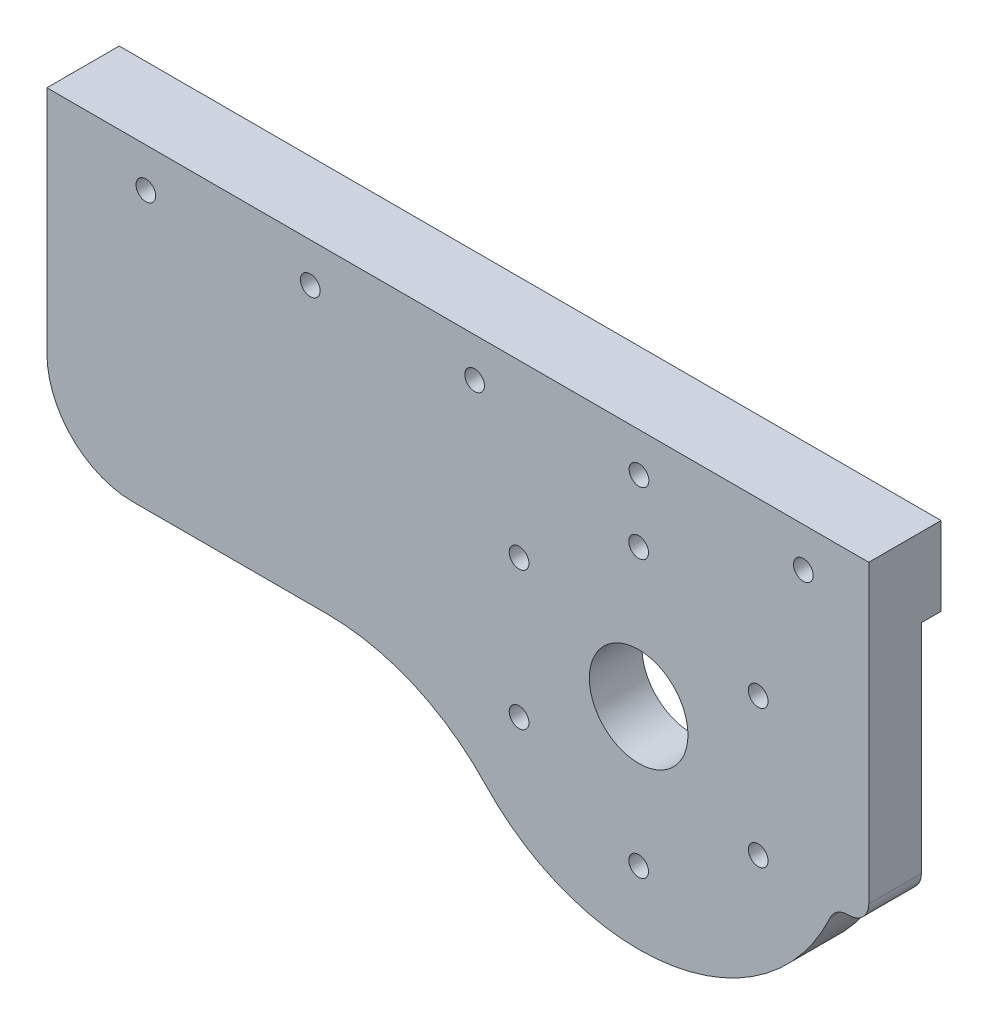
ISO-10303-21;
HEADER;
FILE_DESCRIPTION(('STEP AP214'),'2;1');
FILE_NAME('part.step','',(''),(''),'','','');
FILE_SCHEMA(('AUTOMOTIVE_DESIGN { 1 0 10303 214 1 1 1 1 }'));
ENDSEC;
DATA;
#1=APPLICATION_CONTEXT('core data for automotive mechanical design processes');
#2=APPLICATION_PROTOCOL_DEFINITION('international standard','automotive_design',2000,#1);
#3=PRODUCT_CONTEXT('',#1,'mechanical');
#4=PRODUCT('Part','Part','',(#3));
#5=PRODUCT_RELATED_PRODUCT_CATEGORY('part','',(#4));
#6=PRODUCT_DEFINITION_FORMATION('','',#4);
#7=PRODUCT_DEFINITION_CONTEXT('part definition',#1,'design');
#8=PRODUCT_DEFINITION('design','',#6,#7);
#9=PRODUCT_DEFINITION_SHAPE('','',#8);
#10=(LENGTH_UNIT() NAMED_UNIT(*) SI_UNIT(.MILLI.,.METRE.));
#11=(NAMED_UNIT(*) PLANE_ANGLE_UNIT() SI_UNIT($,.RADIAN.));
#12=(NAMED_UNIT(*) SI_UNIT($,.STERADIAN.) SOLID_ANGLE_UNIT());
#13=UNCERTAINTY_MEASURE_WITH_UNIT(LENGTH_MEASURE(1.E-05),#10,'distance_accuracy_value','');
#14=(GEOMETRIC_REPRESENTATION_CONTEXT(3) GLOBAL_UNCERTAINTY_ASSIGNED_CONTEXT((#13)) GLOBAL_UNIT_ASSIGNED_CONTEXT((#10,
#11,#12)) REPRESENTATION_CONTEXT('',''));
#15=CARTESIAN_POINT('',(0.,0.,0.));
#16=DIRECTION('',(0.,0.,1.));
#17=DIRECTION('',(1.,0.,0.));
#18=AXIS2_PLACEMENT_3D('',#15,#16,#17);
#19=CARTESIAN_POINT('',(-120.531714020429,7.0000077107353,68.1400002949939));
#20=DIRECTION('',(0.,0.,-1.));
#21=DIRECTION('',(-1.,0.,0.));
#22=AXIS2_PLACEMENT_3D('',#19,#20,#21);
#23=CYLINDRICAL_SURFACE('',#22,1.49999999999999);
#24=CARTESIAN_POINT('',(-120.531714020429,7.0000077107353,8.));
#25=DIRECTION('',(0.,0.,1.));
#26=DIRECTION('',(1.,0.,0.));
#27=AXIS2_PLACEMENT_3D('',#24,#25,#26);
#28=CIRCLE('',#27,1.49999999999999);
#29=CARTESIAN_POINT('',(-119.031714020429,7.0000077107353,8.));
#30=VERTEX_POINT('',#29);
#31=EDGE_CURVE('E193',#30,#30,#28,.F.);
#32=ORIENTED_EDGE('',*,*,#31,.F.);
#33=EDGE_LOOP('',(#32));
#34=FACE_BOUND('',#33,.T.);
#35=CARTESIAN_POINT('',(-120.531714020429,7.0000077107353,4.));
#36=DIRECTION('',(0.,0.,-1.));
#37=DIRECTION('',(-1.,0.,0.));
#38=AXIS2_PLACEMENT_3D('',#35,#36,#37);
#39=CIRCLE('',#38,1.49999999999999);
#40=CARTESIAN_POINT('',(-122.031714020429,7.0000077107353,4.));
#41=VERTEX_POINT('',#40);
#42=EDGE_CURVE('E47',#41,#41,#39,.F.);
#43=ORIENTED_EDGE('',*,*,#42,.F.);
#44=EDGE_LOOP('',(#43));
#45=FACE_BOUND('',#44,.T.);
#46=ADVANCED_FACE('F43',(#34,#45),#23,.F.);
#47=CARTESIAN_POINT('',(-138.718247499902,17.5000077107355,68.1400002949939));
#48=DIRECTION('',(0.,0.,-1.));
#49=DIRECTION('',(-1.,0.,0.));
#50=AXIS2_PLACEMENT_3D('',#47,#48,#49);
#51=CYLINDRICAL_SURFACE('',#50,1.5);
#52=CARTESIAN_POINT('',(-138.718247499902,17.5000077107355,8.));
#53=DIRECTION('',(0.,0.,1.));
#54=DIRECTION('',(1.,0.,0.));
#55=AXIS2_PLACEMENT_3D('',#52,#53,#54);
#56=CIRCLE('',#55,1.5);
#57=CARTESIAN_POINT('',(-137.218247499902,17.5000077107355,8.));
#58=VERTEX_POINT('',#57);
#59=EDGE_CURVE('E161',#58,#58,#56,.F.);
#60=ORIENTED_EDGE('',*,*,#59,.F.);
#61=EDGE_LOOP('',(#60));
#62=FACE_BOUND('',#61,.T.);
#63=CARTESIAN_POINT('',(-138.718247499902,17.5000077107355,4.));
#64=DIRECTION('',(0.,0.,-1.));
#65=DIRECTION('',(-1.,0.,0.));
#66=AXIS2_PLACEMENT_3D('',#63,#64,#65);
#67=CIRCLE('',#66,1.5);
#68=CARTESIAN_POINT('',(-140.218247499902,17.5000077107355,4.));
#69=VERTEX_POINT('',#68);
#70=EDGE_CURVE('E296',#69,#69,#67,.F.);
#71=ORIENTED_EDGE('',*,*,#70,.F.);
#72=EDGE_LOOP('',(#71));
#73=FACE_BOUND('',#72,.T.);
#74=ADVANCED_FACE('F408',(#62,#73),#51,.F.);
#75=CARTESIAN_POINT('',(-102.345180540956,17.5000077107352,68.1400002949939));
#76=DIRECTION('',(0.,0.,-1.));
#77=DIRECTION('',(-1.,0.,0.));
#78=AXIS2_PLACEMENT_3D('',#75,#76,#77);
#79=CYLINDRICAL_SURFACE('',#78,1.50000000000001);
#80=CARTESIAN_POINT('',(-102.345180540956,17.5000077107352,8.));
#81=DIRECTION('',(0.,0.,1.));
#82=DIRECTION('',(1.,0.,0.));
#83=AXIS2_PLACEMENT_3D('',#80,#81,#82);
#84=CIRCLE('',#83,1.50000000000001);
#85=CARTESIAN_POINT('',(-100.845180540956,17.5000077107352,8.));
#86=VERTEX_POINT('',#85);
#87=EDGE_CURVE('E205',#86,#86,#84,.F.);
#88=ORIENTED_EDGE('',*,*,#87,.F.);
#89=EDGE_LOOP('',(#88));
#90=FACE_BOUND('',#89,.T.);
#91=CARTESIAN_POINT('',(-102.345180540956,17.5000077107352,4.));
#92=DIRECTION('',(0.,0.,-1.));
#93=DIRECTION('',(-1.,0.,0.));
#94=AXIS2_PLACEMENT_3D('',#91,#92,#93);
#95=CIRCLE('',#94,1.50000000000001);
#96=CARTESIAN_POINT('',(-103.845180540956,17.5000077107352,4.));
#97=VERTEX_POINT('',#96);
#98=EDGE_CURVE('E294',#97,#97,#95,.F.);
#99=ORIENTED_EDGE('',*,*,#98,.F.);
#100=EDGE_LOOP('',(#99));
#101=FACE_BOUND('',#100,.T.);
#102=ADVANCED_FACE('F414',(#90,#101),#79,.F.);
#103=CARTESIAN_POINT('',(-138.718247499902,38.5000077107355,10.));
#104=DIRECTION('',(0.,0.,-1.));
#105=DIRECTION('',(-1.,0.,0.));
#106=AXIS2_PLACEMENT_3D('',#103,#104,#105);
#107=CYLINDRICAL_SURFACE('',#106,1.50000000000001);
#108=CARTESIAN_POINT('',(-138.718247499902,38.5000077107355,8.));
#109=DIRECTION('',(0.,0.,1.));
#110=DIRECTION('',(1.,0.,0.));
#111=AXIS2_PLACEMENT_3D('',#108,#109,#110);
#112=CIRCLE('',#111,1.50000000000001);
#113=CARTESIAN_POINT('',(-137.218247499902,38.5000077107355,8.));
#114=VERTEX_POINT('',#113);
#115=EDGE_CURVE('E158',#114,#114,#112,.F.);
#116=ORIENTED_EDGE('',*,*,#115,.F.);
#117=EDGE_LOOP('',(#116));
#118=FACE_BOUND('',#117,.T.);
#119=CARTESIAN_POINT('',(-138.718247499902,38.5000077107355,4.));
#120=DIRECTION('',(0.,0.,-1.));
#121=DIRECTION('',(-1.,0.,0.));
#122=AXIS2_PLACEMENT_3D('',#119,#120,#121);
#123=CIRCLE('',#122,1.50000000000001);
#124=CARTESIAN_POINT('',(-140.218247499902,38.5000077107355,4.));
#125=VERTEX_POINT('',#124);
#126=EDGE_CURVE('E291',#125,#125,#123,.F.);
#127=ORIENTED_EDGE('',*,*,#126,.F.);
#128=EDGE_LOOP('',(#127));
#129=FACE_BOUND('',#128,.T.);
#130=ADVANCED_FACE('F612',(#118,#129),#107,.F.);
#131=CARTESIAN_POINT('',(-102.345180540956,38.5000077107353,10.));
#132=DIRECTION('',(0.,0.,-1.));
#133=DIRECTION('',(-1.,0.,0.));
#134=AXIS2_PLACEMENT_3D('',#131,#132,#133);
#135=CYLINDRICAL_SURFACE('',#134,1.49999999999998);
#136=CARTESIAN_POINT('',(-102.345180540956,38.5000077107353,8.));
#137=DIRECTION('',(0.,0.,1.));
#138=DIRECTION('',(1.,0.,0.));
#139=AXIS2_PLACEMENT_3D('',#136,#137,#138);
#140=CIRCLE('',#139,1.49999999999998);
#141=CARTESIAN_POINT('',(-100.845180540956,38.5000077107353,8.));
#142=VERTEX_POINT('',#141);
#143=EDGE_CURVE('E208',#142,#142,#140,.F.);
#144=ORIENTED_EDGE('',*,*,#143,.F.);
#145=EDGE_LOOP('',(#144));
#146=FACE_BOUND('',#145,.T.);
#147=CARTESIAN_POINT('',(-102.345180540956,38.5000077107353,4.));
#148=DIRECTION('',(0.,0.,-1.));
#149=DIRECTION('',(-1.,0.,0.));
#150=AXIS2_PLACEMENT_3D('',#147,#148,#149);
#151=CIRCLE('',#150,1.49999999999998);
#152=CARTESIAN_POINT('',(-103.845180540956,38.5000077107353,4.));
#153=VERTEX_POINT('',#152);
#154=EDGE_CURVE('E287',#153,#153,#151,.F.);
#155=ORIENTED_EDGE('',*,*,#154,.F.);
#156=EDGE_LOOP('',(#155));
#157=FACE_BOUND('',#156,.T.);
#158=ADVANCED_FACE('F400',(#146,#157),#135,.F.);
#159=CARTESIAN_POINT('',(-120.531714020429,49.0000077107353,10.));
#160=DIRECTION('',(0.,0.,-1.));
#161=DIRECTION('',(-1.,0.,0.));
#162=AXIS2_PLACEMENT_3D('',#159,#160,#161);
#163=CYLINDRICAL_SURFACE('',#162,1.5);
#164=CARTESIAN_POINT('',(-120.531714020429,49.0000077107353,8.));
#165=DIRECTION('',(0.,0.,1.));
#166=DIRECTION('',(1.,0.,0.));
#167=AXIS2_PLACEMENT_3D('',#164,#165,#166);
#168=CIRCLE('',#167,1.5);
#169=CARTESIAN_POINT('',(-119.031714020429,49.0000077107353,8.));
#170=VERTEX_POINT('',#169);
#171=EDGE_CURVE('E211',#170,#170,#168,.F.);
#172=ORIENTED_EDGE('',*,*,#171,.F.);
#173=EDGE_LOOP('',(#172));
#174=FACE_BOUND('',#173,.T.);
#175=CARTESIAN_POINT('',(-120.531714020429,49.0000077107353,4.));
#176=DIRECTION('',(0.,0.,-1.));
#177=DIRECTION('',(-1.,0.,0.));
#178=AXIS2_PLACEMENT_3D('',#175,#176,#177);
#179=CIRCLE('',#178,1.5);
#180=CARTESIAN_POINT('',(-122.031714020429,49.0000077107353,4.));
#181=VERTEX_POINT('',#180);
#182=EDGE_CURVE('E284',#181,#181,#179,.F.);
#183=ORIENTED_EDGE('',*,*,#182,.F.);
#184=EDGE_LOOP('',(#183));
#185=FACE_BOUND('',#184,.T.);
#186=ADVANCED_FACE('F397',(#174,#185),#163,.F.);
#187=CARTESIAN_POINT('',(0.,16.4955693374218,5.));
#188=DIRECTION('',(0.,-1.,0.));
#189=DIRECTION('',(0.,0.,-1.));
#190=AXIS2_PLACEMENT_3D('',#187,#188,#189);
#191=PLANE('',#190);
#192=DIRECTION('',(0.,0.,1.));
#193=VECTOR('',#192,1.);
#194=CARTESIAN_POINT('',(-167.906337660896,16.4955693374218,5.));
#195=LINE('',#194,#193);
#196=CARTESIAN_POINT('',(-167.906337660896,16.4955693374218,0.));
#197=VERTEX_POINT('',#196);
#198=CARTESIAN_POINT('',(-167.906337660896,16.4955693374218,8.));
#199=VERTEX_POINT('',#198);
#200=EDGE_CURVE('E277',#197,#199,#195,.T.);
#201=ORIENTED_EDGE('',*,*,#200,.T.);
#202=DIRECTION('',(1.,0.,0.));
#203=VECTOR('',#202,1.);
#204=CARTESIAN_POINT('',(0.,16.4955693374218,8.));
#205=LINE('',#204,#203);
#206=CARTESIAN_POINT('',(-197.531714020429,16.4955693374218,8.));
#207=VERTEX_POINT('',#206);
#208=EDGE_CURVE('E166',#207,#199,#205,.T.);
#209=ORIENTED_EDGE('',*,*,#208,.F.);
#210=DIRECTION('',(0.,0.,-1.));
#211=VECTOR('',#210,1.);
#212=CARTESIAN_POINT('',(-197.531714020429,16.4955693374218,5.));
#213=LINE('',#212,#211);
#214=CARTESIAN_POINT('',(-197.531714020429,16.4955693374218,0.));
#215=VERTEX_POINT('',#214);
#216=EDGE_CURVE('E281',#207,#215,#213,.T.);
#217=ORIENTED_EDGE('',*,*,#216,.T.);
#218=DIRECTION('',(-1.,0.,0.));
#219=VECTOR('',#218,1.);
#220=CARTESIAN_POINT('',(0.,16.4955693374218,0.));
#221=LINE('',#220,#219);
#222=EDGE_CURVE('E256',#197,#215,#221,.T.);
#223=ORIENTED_EDGE('',*,*,#222,.F.);
#224=EDGE_LOOP('',(#201,#209,#217,#223));
#225=FACE_BOUND('',#224,.T.);
#226=ADVANCED_FACE('F357',(#225),#191,.T.);
#227=CARTESIAN_POINT('',(0.,0.,0.));
#228=DIRECTION('',(0.,0.,1.));
#229=DIRECTION('',(1.,0.,0.));
#230=AXIS2_PLACEMENT_3D('',#227,#228,#229);
#231=PLANE('',#230);
#232=CARTESIAN_POINT('',(-120.531714020429,49.0000077107353,0.));
#233=DIRECTION('',(0.,0.,-1.));
#234=DIRECTION('',(-1.,0.,0.));
#235=AXIS2_PLACEMENT_3D('',#232,#233,#234);
#236=CIRCLE('',#235,3.00000000000001);
#237=CARTESIAN_POINT('',(-123.531714020429,49.0000077107353,0.));
#238=VERTEX_POINT('',#237);
#239=EDGE_CURVE('E332',#238,#238,#236,.T.);
#240=ORIENTED_EDGE('',*,*,#239,.F.);
#241=EDGE_LOOP('',(#240));
#242=FACE_BOUND('',#241,.T.);
#243=CARTESIAN_POINT('',(-102.345180540956,38.5000077107348,0.));
#244=DIRECTION('',(0.,0.,-1.));
#245=DIRECTION('',(-1.,0.,0.));
#246=AXIS2_PLACEMENT_3D('',#243,#244,#245);
#247=CIRCLE('',#246,2.99999999999998);
#248=CARTESIAN_POINT('',(-105.345180540956,38.5000077107348,0.));
#249=VERTEX_POINT('',#248);
#250=EDGE_CURVE('E311',#249,#249,#247,.T.);
#251=ORIENTED_EDGE('',*,*,#250,.F.);
#252=EDGE_LOOP('',(#251));
#253=FACE_BOUND('',#252,.T.);
#254=CARTESIAN_POINT('',(-102.345180540957,17.5000077107347,0.));
#255=DIRECTION('',(0.,0.,-1.));
#256=DIRECTION('',(-1.,0.,0.));
#257=AXIS2_PLACEMENT_3D('',#254,#255,#256);
#258=CIRCLE('',#257,3.00000000000002);
#259=CARTESIAN_POINT('',(-105.345180540957,17.5000077107347,0.));
#260=VERTEX_POINT('',#259);
#261=EDGE_CURVE('E310',#260,#260,#258,.T.);
#262=ORIENTED_EDGE('',*,*,#261,.F.);
#263=EDGE_LOOP('',(#262));
#264=FACE_BOUND('',#263,.T.);
#265=CARTESIAN_POINT('',(-120.531714020429,7.00000771073605,0.));
#266=DIRECTION('',(0.,0.,-1.));
#267=DIRECTION('',(-1.,0.,0.));
#268=AXIS2_PLACEMENT_3D('',#265,#266,#267);
#269=CIRCLE('',#268,2.99999999999883);
#270=CARTESIAN_POINT('',(-123.531714020428,7.00000771073605,0.));
#271=VERTEX_POINT('',#270);
#272=EDGE_CURVE('E317',#271,#271,#269,.T.);
#273=ORIENTED_EDGE('',*,*,#272,.F.);
#274=EDGE_LOOP('',(#273));
#275=FACE_BOUND('',#274,.T.);
#276=CARTESIAN_POINT('',(-138.718247499901,17.5000077107358,0.));
#277=DIRECTION('',(0.,0.,-1.));
#278=DIRECTION('',(-1.,0.,0.));
#279=AXIS2_PLACEMENT_3D('',#276,#277,#278);
#280=CIRCLE('',#279,2.99999999999948);
#281=CARTESIAN_POINT('',(-141.718247499901,17.5000077107358,0.));
#282=VERTEX_POINT('',#281);
#283=EDGE_CURVE('E323',#282,#282,#280,.T.);
#284=ORIENTED_EDGE('',*,*,#283,.F.);
#285=EDGE_LOOP('',(#284));
#286=FACE_BOUND('',#285,.T.);
#287=CARTESIAN_POINT('',(-138.718247499902,38.500007710736,0.));
#288=DIRECTION('',(0.,0.,-1.));
#289=DIRECTION('',(-1.,0.,0.));
#290=AXIS2_PLACEMENT_3D('',#287,#288,#289);
#291=CIRCLE('',#290,3.);
#292=CARTESIAN_POINT('',(-141.718247499902,38.500007710736,0.));
#293=VERTEX_POINT('',#292);
#294=EDGE_CURVE('E329',#293,#293,#291,.T.);
#295=ORIENTED_EDGE('',*,*,#294,.F.);
#296=EDGE_LOOP('',(#295));
#297=FACE_BOUND('',#296,.T.);
#298=ORIENTED_EDGE('',*,*,#222,.T.);
#299=CARTESIAN_POINT('',(-197.531714020429,29.4955693374218,0.));
#300=DIRECTION('',(0.,0.,1.));
#301=DIRECTION('',(1.,0.,0.));
#302=AXIS2_PLACEMENT_3D('',#299,#300,#301);
#303=CIRCLE('',#302,13.);
#304=CARTESIAN_POINT('',(-210.531714020429,29.4955693374218,0.));
#305=VERTEX_POINT('',#304);
#306=EDGE_CURVE('E52',#215,#305,#303,.F.);
#307=ORIENTED_EDGE('',*,*,#306,.T.);
#308=DIRECTION('',(0.,1.,0.));
#309=VECTOR('',#308,1.);
#310=CARTESIAN_POINT('',(-210.531714020429,0.,0.));
#311=LINE('',#310,#309);
#312=CARTESIAN_POINT('',(-210.531714020429,52.5308995809068,0.));
#313=VERTEX_POINT('',#312);
#314=EDGE_CURVE('E254',#305,#313,#311,.T.);
#315=ORIENTED_EDGE('',*,*,#314,.T.);
#316=DIRECTION('',(-1.,0.,0.));
#317=VECTOR('',#316,1.);
#318=CARTESIAN_POINT('',(0.,52.5308995809068,0.));
#319=LINE('',#318,#317);
#320=CARTESIAN_POINT('',(-85.5317140204288,52.5308995809068,0.));
#321=VERTEX_POINT('',#320);
#322=EDGE_CURVE('E220',#321,#313,#319,.T.);
#323=ORIENTED_EDGE('',*,*,#322,.F.);
#324=DIRECTION('',(0.,-1.,0.));
#325=VECTOR('',#324,1.);
#326=CARTESIAN_POINT('',(-85.531714020429,3.21476723212174E-13,0.));
#327=LINE('',#326,#325);
#328=CARTESIAN_POINT('',(-85.5317140204289,19.4955693374217,0.));
#329=VERTEX_POINT('',#328);
#330=EDGE_CURVE('E249',#321,#329,#327,.T.);
#331=ORIENTED_EDGE('',*,*,#330,.T.);
#332=CARTESIAN_POINT('',(-88.5317140204289,19.4955693374218,0.));
#333=DIRECTION('',(0.,0.,1.));
#334=DIRECTION('',(1.,0.,0.));
#335=AXIS2_PLACEMENT_3D('',#332,#333,#334);
#336=CIRCLE('',#335,3.);
#337=CARTESIAN_POINT('',(-88.5317140204289,16.4955693374218,0.));
#338=VERTEX_POINT('',#337);
#339=EDGE_CURVE('E270',#329,#338,#336,.F.);
#340=ORIENTED_EDGE('',*,*,#339,.T.);
#341=CARTESIAN_POINT('',(-88.6785938047458,16.4955693374218,0.));
#342=VERTEX_POINT('',#341);
#343=EDGE_CURVE('E142',#338,#342,#221,.T.);
#344=ORIENTED_EDGE('',*,*,#343,.T.);
#345=CARTESIAN_POINT('',(-88.6785938047458,13.4955693374218,0.));
#346=DIRECTION('',(0.,0.,1.));
#347=DIRECTION('',(1.,0.,0.));
#348=AXIS2_PLACEMENT_3D('',#345,#346,#347);
#349=CIRCLE('',#348,3.);
#350=CARTESIAN_POINT('',(-91.4088612518044,14.7388069122772,0.));
#351=VERTEX_POINT('',#350);
#352=EDGE_CURVE('E272',#342,#351,#349,.T.);
#353=ORIENTED_EDGE('',*,*,#352,.T.);
#354=CARTESIAN_POINT('',(-120.531714020429,28.0000077107353,0.));
#355=DIRECTION('',(0.,0.,-1.));
#356=DIRECTION('',(-1.,0.,0.));
#357=AXIS2_PLACEMENT_3D('',#354,#355,#356);
#358=CIRCLE('',#357,32.);
#359=CARTESIAN_POINT('',(-143.854605658813,6.0901303577194,0.));
#360=VERTEX_POINT('',#359);
#361=EDGE_CURVE('E214',#351,#360,#358,.T.);
#362=ORIENTED_EDGE('',*,*,#361,.T.);
#363=CARTESIAN_POINT('',(-167.906337660896,-16.5044306625782,0.));
#364=DIRECTION('',(0.,0.,1.));
#365=DIRECTION('',(1.,0.,0.));
#366=AXIS2_PLACEMENT_3D('',#363,#364,#365);
#367=CIRCLE('',#366,33.);
#368=EDGE_CURVE('E279',#360,#197,#367,.T.);
#369=ORIENTED_EDGE('',*,*,#368,.T.);
#370=EDGE_LOOP('',(#298,#307,#315,#323,#331,#340,#344,#353,#362,#369));
#371=FACE_BOUND('',#370,.T.);
#372=CARTESIAN_POINT('',(-120.531714020429,28.0000077107353,0.));
#373=DIRECTION('',(0.,0.,-1.));
#374=DIRECTION('',(-1.,0.,0.));
#375=AXIS2_PLACEMENT_3D('',#372,#373,#374);
#376=CIRCLE('',#375,7.5);
#377=CARTESIAN_POINT('',(-128.031714020429,28.0000077107353,0.));
#378=VERTEX_POINT('',#377);
#379=EDGE_CURVE('E217',#378,#378,#376,.T.);
#380=ORIENTED_EDGE('',*,*,#379,.F.);
#381=EDGE_LOOP('',(#380));
#382=FACE_BOUND('',#381,.T.);
#383=ADVANCED_FACE('F353',(#242,#253,#264,#275,#286,#297,#371,#382),#231,.F.);
#384=CARTESIAN_POINT('',(-85.531714020429,3.21476723212174E-13,5.));
#385=DIRECTION('',(1.,0.,0.));
#386=DIRECTION('',(0.,1.,0.));
#387=AXIS2_PLACEMENT_3D('',#384,#385,#386);
#388=PLANE('',#387);
#389=DIRECTION('',(0.,0.,-1.));
#390=VECTOR('',#389,1.);
#391=CARTESIAN_POINT('',(-85.5317140204288,64.4955693374218,5.));
#392=LINE('',#391,#390);
#393=CARTESIAN_POINT('',(-85.5317140204288,64.4955693374218,8.));
#394=VERTEX_POINT('',#393);
#395=CARTESIAN_POINT('',(-85.5317140204288,64.4955693374218,-3.));
#396=VERTEX_POINT('',#395);
#397=EDGE_CURVE('E141',#394,#396,#392,.T.);
#398=ORIENTED_EDGE('',*,*,#397,.F.);
#399=DIRECTION('',(0.,1.,0.));
#400=VECTOR('',#399,1.);
#401=CARTESIAN_POINT('',(-85.531714020429,3.21476723212174E-13,8.));
#402=LINE('',#401,#400);
#403=CARTESIAN_POINT('',(-85.5317140204289,19.4955693374217,8.));
#404=VERTEX_POINT('',#403);
#405=EDGE_CURVE('E157',#404,#394,#402,.T.);
#406=ORIENTED_EDGE('',*,*,#405,.F.);
#407=DIRECTION('',(0.,0.,-1.));
#408=VECTOR('',#407,1.);
#409=CARTESIAN_POINT('',(-85.5317140204289,19.4955693374217,5.));
#410=LINE('',#409,#408);
#411=EDGE_CURVE('E267',#404,#329,#410,.T.);
#412=ORIENTED_EDGE('',*,*,#411,.T.);
#413=ORIENTED_EDGE('',*,*,#330,.F.);
#414=DIRECTION('',(0.,0.,1.));
#415=VECTOR('',#414,1.);
#416=CARTESIAN_POINT('',(-85.5317140204288,52.5308995809068,-3.));
#417=LINE('',#416,#415);
#418=CARTESIAN_POINT('',(-85.5317140204288,52.5308995809068,-3.));
#419=VERTEX_POINT('',#418);
#420=EDGE_CURVE('E246',#419,#321,#417,.T.);
#421=ORIENTED_EDGE('',*,*,#420,.F.);
#422=DIRECTION('',(0.,-1.,0.));
#423=VECTOR('',#422,1.);
#424=CARTESIAN_POINT('',(-85.531714020429,3.21476723212174E-13,-3.));
#425=LINE('',#424,#423);
#426=EDGE_CURVE('E225',#396,#419,#425,.T.);
#427=ORIENTED_EDGE('',*,*,#426,.F.);
#428=EDGE_LOOP('',(#398,#406,#412,#413,#421,#427));
#429=FACE_BOUND('',#428,.T.);
#430=ADVANCED_FACE('F356',(#429),#388,.T.);
#431=CARTESIAN_POINT('',(0.,64.4955693374218,5.));
#432=DIRECTION('',(0.,1.,0.));
#433=DIRECTION('',(-1.,0.,0.));
#434=AXIS2_PLACEMENT_3D('',#431,#432,#433);
#435=PLANE('',#434);
#436=ORIENTED_EDGE('',*,*,#397,.T.);
#437=DIRECTION('',(1.,0.,0.));
#438=VECTOR('',#437,1.);
#439=CARTESIAN_POINT('',(0.,64.4955693374218,-3.));
#440=LINE('',#439,#438);
#441=CARTESIAN_POINT('',(-210.531714020429,64.4955693374218,-3.));
#442=VERTEX_POINT('',#441);
#443=EDGE_CURVE('E137',#442,#396,#440,.T.);
#444=ORIENTED_EDGE('',*,*,#443,.F.);
#445=DIRECTION('',(0.,0.,-1.));
#446=VECTOR('',#445,1.);
#447=CARTESIAN_POINT('',(-210.531714020429,64.4955693374218,5.));
#448=LINE('',#447,#446);
#449=CARTESIAN_POINT('',(-210.531714020429,64.4955693374218,8.));
#450=VERTEX_POINT('',#449);
#451=EDGE_CURVE('E131',#450,#442,#448,.T.);
#452=ORIENTED_EDGE('',*,*,#451,.F.);
#453=DIRECTION('',(-1.,0.,0.));
#454=VECTOR('',#453,1.);
#455=CARTESIAN_POINT('',(0.,64.4955693374218,8.));
#456=LINE('',#455,#454);
#457=EDGE_CURVE('E135',#394,#450,#456,.T.);
#458=ORIENTED_EDGE('',*,*,#457,.F.);
#459=EDGE_LOOP('',(#436,#444,#452,#458));
#460=FACE_BOUND('',#459,.T.);
#461=ADVANCED_FACE('F133',(#460),#435,.T.);
#462=CARTESIAN_POINT('',(-210.531714020429,0.,5.));
#463=DIRECTION('',(-1.,0.,0.));
#464=DIRECTION('',(0.,0.,1.));
#465=AXIS2_PLACEMENT_3D('',#462,#463,#464);
#466=PLANE('',#465);
#467=ORIENTED_EDGE('',*,*,#314,.F.);
#468=DIRECTION('',(0.,0.,-1.));
#469=VECTOR('',#468,1.);
#470=CARTESIAN_POINT('',(-210.531714020429,29.4955693374218,5.));
#471=LINE('',#470,#469);
#472=CARTESIAN_POINT('',(-210.531714020429,29.4955693374218,8.));
#473=VERTEX_POINT('',#472);
#474=EDGE_CURVE('E11',#305,#473,#471,.F.);
#475=ORIENTED_EDGE('',*,*,#474,.T.);
#476=DIRECTION('',(0.,-1.,0.));
#477=VECTOR('',#476,1.);
#478=CARTESIAN_POINT('',(-210.531714020429,0.,8.));
#479=LINE('',#478,#477);
#480=EDGE_CURVE('E145',#450,#473,#479,.T.);
#481=ORIENTED_EDGE('',*,*,#480,.F.);
#482=ORIENTED_EDGE('',*,*,#451,.T.);
#483=DIRECTION('',(0.,1.,0.));
#484=VECTOR('',#483,1.);
#485=CARTESIAN_POINT('',(-210.531714020429,0.,-3.));
#486=LINE('',#485,#484);
#487=CARTESIAN_POINT('',(-210.531714020429,52.5308995809068,-3.));
#488=VERTEX_POINT('',#487);
#489=EDGE_CURVE('E221',#488,#442,#486,.T.);
#490=ORIENTED_EDGE('',*,*,#489,.F.);
#491=DIRECTION('',(0.,0.,1.));
#492=VECTOR('',#491,1.);
#493=CARTESIAN_POINT('',(-210.531714020429,52.5308995809068,-3.));
#494=LINE('',#493,#492);
#495=EDGE_CURVE('E243',#488,#313,#494,.T.);
#496=ORIENTED_EDGE('',*,*,#495,.T.);
#497=EDGE_LOOP('',(#467,#475,#481,#482,#490,#496));
#498=FACE_BOUND('',#497,.T.);
#499=ADVANCED_FACE('F146',(#498),#466,.T.);
#500=CARTESIAN_POINT('',(-120.479533864924,58.513234459671,5.));
#501=DIRECTION('',(0.,0.,-1.));
#502=DIRECTION('',(-1.,0.,0.));
#503=AXIS2_PLACEMENT_3D('',#500,#501,#502);
#504=CYLINDRICAL_SURFACE('',#503,1.5);
#505=CARTESIAN_POINT('',(-120.479533864924,58.513234459671,-3.));
#506=DIRECTION('',(0.,0.,1.));
#507=DIRECTION('',(1.,0.,0.));
#508=AXIS2_PLACEMENT_3D('',#505,#506,#507);
#509=CIRCLE('',#508,1.5);
#510=CARTESIAN_POINT('',(-118.979533864924,58.513234459671,-3.));
#511=VERTEX_POINT('',#510);
#512=EDGE_CURVE('E237',#511,#511,#509,.T.);
#513=ORIENTED_EDGE('',*,*,#512,.F.);
#514=EDGE_LOOP('',(#513));
#515=FACE_BOUND('',#514,.T.);
#516=CARTESIAN_POINT('',(-120.479533864924,58.513234459671,8.));
#517=DIRECTION('',(0.,0.,1.));
#518=DIRECTION('',(1.,0.,0.));
#519=AXIS2_PLACEMENT_3D('',#516,#517,#518);
#520=CIRCLE('',#519,1.5);
#521=CARTESIAN_POINT('',(-118.979533864924,58.513234459671,8.));
#522=VERTEX_POINT('',#521);
#523=EDGE_CURVE('E187',#522,#522,#520,.F.);
#524=ORIENTED_EDGE('',*,*,#523,.F.);
#525=EDGE_LOOP('',(#524));
#526=FACE_BOUND('',#525,.T.);
#527=ADVANCED_FACE('F432',(#515,#526),#504,.F.);
#528=CARTESIAN_POINT('',(-145.479533864924,58.5132344596708,5.));
#529=DIRECTION('',(0.,0.,-1.));
#530=DIRECTION('',(-1.,0.,0.));
#531=AXIS2_PLACEMENT_3D('',#528,#529,#530);
#532=CYLINDRICAL_SURFACE('',#531,1.50000000000002);
#533=CARTESIAN_POINT('',(-145.479533864924,58.5132344596708,-3.));
#534=DIRECTION('',(0.,0.,1.));
#535=DIRECTION('',(1.,0.,0.));
#536=AXIS2_PLACEMENT_3D('',#533,#534,#535);
#537=CIRCLE('',#536,1.50000000000002);
#538=CARTESIAN_POINT('',(-143.979533864924,58.5132344596708,-3.));
#539=VERTEX_POINT('',#538);
#540=EDGE_CURVE('E234',#539,#539,#537,.T.);
#541=ORIENTED_EDGE('',*,*,#540,.F.);
#542=EDGE_LOOP('',(#541));
#543=FACE_BOUND('',#542,.T.);
#544=CARTESIAN_POINT('',(-145.479533864924,58.5132344596708,8.));
#545=DIRECTION('',(0.,0.,1.));
#546=DIRECTION('',(1.,0.,0.));
#547=AXIS2_PLACEMENT_3D('',#544,#545,#546);
#548=CIRCLE('',#547,1.50000000000002);
#549=CARTESIAN_POINT('',(-143.979533864924,58.5132344596708,8.));
#550=VERTEX_POINT('',#549);
#551=EDGE_CURVE('E199',#550,#550,#548,.F.);
#552=ORIENTED_EDGE('',*,*,#551,.F.);
#553=EDGE_LOOP('',(#552));
#554=FACE_BOUND('',#553,.T.);
#555=ADVANCED_FACE('F435',(#543,#554),#532,.F.);
#556=CARTESIAN_POINT('',(-95.4795338649241,58.5132344596711,5.));
#557=DIRECTION('',(0.,0.,-1.));
#558=DIRECTION('',(-1.,0.,0.));
#559=AXIS2_PLACEMENT_3D('',#556,#557,#558);
#560=CYLINDRICAL_SURFACE('',#559,1.5);
#561=CARTESIAN_POINT('',(-95.4795338649241,58.5132344596711,-3.));
#562=DIRECTION('',(0.,0.,1.));
#563=DIRECTION('',(1.,0.,0.));
#564=AXIS2_PLACEMENT_3D('',#561,#562,#563);
#565=CIRCLE('',#564,1.5);
#566=CARTESIAN_POINT('',(-93.9795338649241,58.5132344596711,-3.));
#567=VERTEX_POINT('',#566);
#568=EDGE_CURVE('E231',#567,#567,#565,.T.);
#569=ORIENTED_EDGE('',*,*,#568,.F.);
#570=EDGE_LOOP('',(#569));
#571=FACE_BOUND('',#570,.T.);
#572=CARTESIAN_POINT('',(-95.4795338649241,58.5132344596711,8.));
#573=DIRECTION('',(0.,0.,1.));
#574=DIRECTION('',(1.,0.,0.));
#575=AXIS2_PLACEMENT_3D('',#572,#573,#574);
#576=CIRCLE('',#575,1.5);
#577=CARTESIAN_POINT('',(-93.9795338649241,58.5132344596711,8.));
#578=VERTEX_POINT('',#577);
#579=EDGE_CURVE('E184',#578,#578,#576,.F.);
#580=ORIENTED_EDGE('',*,*,#579,.F.);
#581=EDGE_LOOP('',(#580));
#582=FACE_BOUND('',#581,.T.);
#583=ADVANCED_FACE('F439',(#571,#582),#560,.F.);
#584=CARTESIAN_POINT('',(-195.479533864924,58.5132344596704,5.));
#585=DIRECTION('',(0.,0.,-1.));
#586=DIRECTION('',(-1.,0.,0.));
#587=AXIS2_PLACEMENT_3D('',#584,#585,#586);
#588=CYLINDRICAL_SURFACE('',#587,1.5);
#589=CARTESIAN_POINT('',(-195.479533864924,58.5132344596704,-3.));
#590=DIRECTION('',(0.,0.,1.));
#591=DIRECTION('',(1.,0.,0.));
#592=AXIS2_PLACEMENT_3D('',#589,#590,#591);
#593=CIRCLE('',#592,1.5);
#594=CARTESIAN_POINT('',(-193.979533864924,58.5132344596704,-3.));
#595=VERTEX_POINT('',#594);
#596=EDGE_CURVE('E228',#595,#595,#593,.T.);
#597=ORIENTED_EDGE('',*,*,#596,.F.);
#598=EDGE_LOOP('',(#597));
#599=FACE_BOUND('',#598,.T.);
#600=CARTESIAN_POINT('',(-195.479533864924,58.5132344596704,8.));
#601=DIRECTION('',(0.,0.,1.));
#602=DIRECTION('',(1.,0.,0.));
#603=AXIS2_PLACEMENT_3D('',#600,#601,#602);
#604=CIRCLE('',#603,1.5);
#605=CARTESIAN_POINT('',(-193.979533864924,58.5132344596704,8.));
#606=VERTEX_POINT('',#605);
#607=EDGE_CURVE('E202',#606,#606,#604,.F.);
#608=ORIENTED_EDGE('',*,*,#607,.F.);
#609=EDGE_LOOP('',(#608));
#610=FACE_BOUND('',#609,.T.);
#611=ADVANCED_FACE('F443',(#599,#610),#588,.F.);
#612=DIRECTION('',(0.,0.,-1.));
#613=VECTOR('',#612,1.);
#614=CARTESIAN_POINT('',(-88.5317140204289,16.4955693374218,5.));
#615=LINE('',#614,#613);
#616=CARTESIAN_POINT('',(-88.5317140204289,16.4955693374218,8.));
#617=VERTEX_POINT('',#616);
#618=EDGE_CURVE('E260',#338,#617,#615,.F.);
#619=ORIENTED_EDGE('',*,*,#618,.T.);
#620=DIRECTION('',(1.,0.,0.));
#621=VECTOR('',#620,1.);
#622=CARTESIAN_POINT('',(0.,16.4955693374218,8.));
#623=LINE('',#622,#621);
#624=CARTESIAN_POINT('',(-88.6785938047458,16.4955693374218,8.));
#625=VERTEX_POINT('',#624);
#626=EDGE_CURVE('E178',#625,#617,#623,.T.);
#627=ORIENTED_EDGE('',*,*,#626,.F.);
#628=DIRECTION('',(0.,0.,1.));
#629=VECTOR('',#628,1.);
#630=CARTESIAN_POINT('',(-88.6785938047458,16.4955693374218,0.));
#631=LINE('',#630,#629);
#632=EDGE_CURVE('E262',#625,#342,#631,.F.);
#633=ORIENTED_EDGE('',*,*,#632,.T.);
#634=ORIENTED_EDGE('',*,*,#343,.F.);
#635=EDGE_LOOP('',(#619,#627,#633,#634));
#636=FACE_BOUND('',#635,.T.);
#637=ADVANCED_FACE('F430',(#636),#191,.T.);
#638=CARTESIAN_POINT('',(-170.479533864924,58.5132344596706,5.));
#639=DIRECTION('',(0.,0.,-1.));
#640=DIRECTION('',(-1.,0.,0.));
#641=AXIS2_PLACEMENT_3D('',#638,#639,#640);
#642=CYLINDRICAL_SURFACE('',#641,1.5);
#643=CARTESIAN_POINT('',(-170.479533864924,58.5132344596706,-3.));
#644=DIRECTION('',(0.,0.,1.));
#645=DIRECTION('',(1.,0.,0.));
#646=AXIS2_PLACEMENT_3D('',#643,#644,#645);
#647=CIRCLE('',#646,1.5);
#648=CARTESIAN_POINT('',(-168.979533864924,58.5132344596706,-3.));
#649=VERTEX_POINT('',#648);
#650=EDGE_CURVE('E240',#649,#649,#647,.T.);
#651=ORIENTED_EDGE('',*,*,#650,.F.);
#652=EDGE_LOOP('',(#651));
#653=FACE_BOUND('',#652,.T.);
#654=CARTESIAN_POINT('',(-170.479533864924,58.5132344596706,8.));
#655=DIRECTION('',(0.,0.,1.));
#656=DIRECTION('',(1.,0.,0.));
#657=AXIS2_PLACEMENT_3D('',#654,#655,#656);
#658=CIRCLE('',#657,1.5);
#659=CARTESIAN_POINT('',(-168.979533864924,58.5132344596706,8.));
#660=VERTEX_POINT('',#659);
#661=EDGE_CURVE('E196',#660,#660,#658,.F.);
#662=ORIENTED_EDGE('',*,*,#661,.F.);
#663=EDGE_LOOP('',(#662));
#664=FACE_BOUND('',#663,.T.);
#665=ADVANCED_FACE('F425',(#653,#664),#642,.F.);
#666=CARTESIAN_POINT('',(0.,52.5308995809068,-3.));
#667=DIRECTION('',(0.,1.,0.));
#668=DIRECTION('',(-1.,0.,0.));
#669=AXIS2_PLACEMENT_3D('',#666,#667,#668);
#670=PLANE('',#669);
#671=ORIENTED_EDGE('',*,*,#322,.T.);
#672=ORIENTED_EDGE('',*,*,#495,.F.);
#673=DIRECTION('',(-1.,0.,0.));
#674=VECTOR('',#673,1.);
#675=CARTESIAN_POINT('',(0.,52.5308995809068,-3.));
#676=LINE('',#675,#674);
#677=EDGE_CURVE('E223',#419,#488,#676,.T.);
#678=ORIENTED_EDGE('',*,*,#677,.F.);
#679=ORIENTED_EDGE('',*,*,#420,.T.);
#680=EDGE_LOOP('',(#671,#672,#678,#679));
#681=FACE_BOUND('',#680,.T.);
#682=ADVANCED_FACE('F422',(#681),#670,.F.);
#683=CARTESIAN_POINT('',(0.,0.,-3.));
#684=DIRECTION('',(0.,0.,1.));
#685=DIRECTION('',(1.,0.,0.));
#686=AXIS2_PLACEMENT_3D('',#683,#684,#685);
#687=PLANE('',#686);
#688=ORIENTED_EDGE('',*,*,#489,.T.);
#689=ORIENTED_EDGE('',*,*,#443,.T.);
#690=ORIENTED_EDGE('',*,*,#426,.T.);
#691=ORIENTED_EDGE('',*,*,#677,.T.);
#692=EDGE_LOOP('',(#688,#689,#690,#691));
#693=FACE_BOUND('',#692,.T.);
#694=ORIENTED_EDGE('',*,*,#596,.T.);
#695=EDGE_LOOP('',(#694));
#696=FACE_BOUND('',#695,.T.);
#697=ORIENTED_EDGE('',*,*,#568,.T.);
#698=EDGE_LOOP('',(#697));
#699=FACE_BOUND('',#698,.T.);
#700=ORIENTED_EDGE('',*,*,#540,.T.);
#701=EDGE_LOOP('',(#700));
#702=FACE_BOUND('',#701,.T.);
#703=ORIENTED_EDGE('',*,*,#512,.T.);
#704=EDGE_LOOP('',(#703));
#705=FACE_BOUND('',#704,.T.);
#706=ORIENTED_EDGE('',*,*,#650,.T.);
#707=EDGE_LOOP('',(#706));
#708=FACE_BOUND('',#707,.T.);
#709=ADVANCED_FACE('F376',(#693,#696,#699,#702,#705,#708),#687,.F.);
#710=CARTESIAN_POINT('',(-120.531714020429,28.0000077107353,29.0416305603426));
#711=DIRECTION('',(0.,0.,-1.));
#712=DIRECTION('',(-1.,0.,0.));
#713=AXIS2_PLACEMENT_3D('',#710,#711,#712);
#714=CYLINDRICAL_SURFACE('',#713,7.5);
#715=ORIENTED_EDGE('',*,*,#379,.T.);
#716=EDGE_LOOP('',(#715));
#717=FACE_BOUND('',#716,.T.);
#718=CARTESIAN_POINT('',(-120.531714020429,28.0000077107353,8.));
#719=DIRECTION('',(0.,0.,1.));
#720=DIRECTION('',(1.,0.,0.));
#721=AXIS2_PLACEMENT_3D('',#718,#719,#720);
#722=CIRCLE('',#721,7.5);
#723=CARTESIAN_POINT('',(-113.031714020429,28.0000077107353,8.));
#724=VERTEX_POINT('',#723);
#725=EDGE_CURVE('E190',#724,#724,#722,.F.);
#726=ORIENTED_EDGE('',*,*,#725,.F.);
#727=EDGE_LOOP('',(#726));
#728=FACE_BOUND('',#727,.T.);
#729=ADVANCED_FACE('F372',(#717,#728),#714,.F.);
#730=CARTESIAN_POINT('',(-120.531714020429,28.0000077107353,68.1400002949939));
#731=DIRECTION('',(0.,0.,-1.));
#732=DIRECTION('',(-1.,0.,0.));
#733=AXIS2_PLACEMENT_3D('',#730,#731,#732);
#734=CYLINDRICAL_SURFACE('',#733,32.);
#735=DIRECTION('',(0.,0.,-1.));
#736=VECTOR('',#735,1.);
#737=CARTESIAN_POINT('',(-91.4088612518044,14.7388069122772,68.1400002949939));
#738=LINE('',#737,#736);
#739=CARTESIAN_POINT('',(-91.4088612518044,14.7388069122772,8.));
#740=VERTEX_POINT('',#739);
#741=EDGE_CURVE('E265',#351,#740,#738,.F.);
#742=ORIENTED_EDGE('',*,*,#741,.T.);
#743=CARTESIAN_POINT('',(-120.531714020429,28.0000077107353,8.));
#744=DIRECTION('',(0.,0.,1.));
#745=DIRECTION('',(1.,0.,0.));
#746=AXIS2_PLACEMENT_3D('',#743,#744,#745);
#747=CIRCLE('',#746,32.);
#748=CARTESIAN_POINT('',(-143.854605658813,6.0901303577194,8.));
#749=VERTEX_POINT('',#748);
#750=EDGE_CURVE('E172',#749,#740,#747,.T.);
#751=ORIENTED_EDGE('',*,*,#750,.F.);
#752=DIRECTION('',(0.,0.,-1.));
#753=VECTOR('',#752,1.);
#754=CARTESIAN_POINT('',(-143.854605658813,6.0901303577194,68.1400002949939));
#755=LINE('',#754,#753);
#756=EDGE_CURVE('E274',#749,#360,#755,.T.);
#757=ORIENTED_EDGE('',*,*,#756,.T.);
#758=ORIENTED_EDGE('',*,*,#361,.F.);
#759=EDGE_LOOP('',(#742,#751,#757,#758));
#760=FACE_BOUND('',#759,.T.);
#761=ADVANCED_FACE('F375',(#760),#734,.T.);
#762=CARTESIAN_POINT('',(-88.6785938047458,13.4955693374218,68.1400002949939));
#763=DIRECTION('',(0.,0.,-1.));
#764=DIRECTION('',(-1.,0.,0.));
#765=AXIS2_PLACEMENT_3D('',#762,#763,#764);
#766=CYLINDRICAL_SURFACE('',#765,3.);
#767=ORIENTED_EDGE('',*,*,#632,.F.);
#768=CARTESIAN_POINT('',(-88.6785938047458,13.4955693374218,8.));
#769=DIRECTION('',(0.,0.,1.));
#770=DIRECTION('',(1.,0.,0.));
#771=AXIS2_PLACEMENT_3D('',#768,#769,#770);
#772=CIRCLE('',#771,3.);
#773=EDGE_CURVE('E175',#740,#625,#772,.F.);
#774=ORIENTED_EDGE('',*,*,#773,.F.);
#775=ORIENTED_EDGE('',*,*,#741,.F.);
#776=ORIENTED_EDGE('',*,*,#352,.F.);
#777=EDGE_LOOP('',(#767,#774,#775,#776));
#778=FACE_BOUND('',#777,.T.);
#779=ADVANCED_FACE('F458',(#778),#766,.F.);
#780=CARTESIAN_POINT('',(-88.5317140204289,19.4955693374218,5.));
#781=DIRECTION('',(0.,0.,-1.));
#782=DIRECTION('',(-1.,0.,0.));
#783=AXIS2_PLACEMENT_3D('',#780,#781,#782);
#784=CYLINDRICAL_SURFACE('',#783,3.);
#785=ORIENTED_EDGE('',*,*,#411,.F.);
#786=CARTESIAN_POINT('',(-88.5317140204289,19.4955693374218,8.));
#787=DIRECTION('',(0.,0.,1.));
#788=DIRECTION('',(1.,0.,0.));
#789=AXIS2_PLACEMENT_3D('',#786,#787,#788);
#790=CIRCLE('',#789,3.);
#791=EDGE_CURVE('E181',#617,#404,#790,.T.);
#792=ORIENTED_EDGE('',*,*,#791,.F.);
#793=ORIENTED_EDGE('',*,*,#618,.F.);
#794=ORIENTED_EDGE('',*,*,#339,.F.);
#795=EDGE_LOOP('',(#785,#792,#793,#794));
#796=FACE_BOUND('',#795,.T.);
#797=ADVANCED_FACE('F461',(#796),#784,.T.);
#798=CARTESIAN_POINT('',(-167.906337660896,-16.5044306625782,68.1400002949939));
#799=DIRECTION('',(0.,0.,-1.));
#800=DIRECTION('',(-1.,0.,0.));
#801=AXIS2_PLACEMENT_3D('',#798,#799,#800);
#802=CYLINDRICAL_SURFACE('',#801,33.);
#803=ORIENTED_EDGE('',*,*,#756,.F.);
#804=CARTESIAN_POINT('',(-167.906337660896,-16.5044306625782,8.));
#805=DIRECTION('',(0.,0.,1.));
#806=DIRECTION('',(1.,0.,0.));
#807=AXIS2_PLACEMENT_3D('',#804,#805,#806);
#808=CIRCLE('',#807,33.);
#809=EDGE_CURVE('E169',#199,#749,#808,.F.);
#810=ORIENTED_EDGE('',*,*,#809,.F.);
#811=ORIENTED_EDGE('',*,*,#200,.F.);
#812=ORIENTED_EDGE('',*,*,#368,.F.);
#813=EDGE_LOOP('',(#803,#810,#811,#812));
#814=FACE_BOUND('',#813,.T.);
#815=ADVANCED_FACE('F464',(#814),#802,.F.);
#816=CARTESIAN_POINT('',(-197.531714020429,29.4955693374218,5.));
#817=DIRECTION('',(0.,0.,-1.));
#818=DIRECTION('',(-1.,0.,0.));
#819=AXIS2_PLACEMENT_3D('',#816,#817,#818);
#820=CYLINDRICAL_SURFACE('',#819,13.);
#821=ORIENTED_EDGE('',*,*,#216,.F.);
#822=CARTESIAN_POINT('',(-197.531714020429,29.4955693374218,8.));
#823=DIRECTION('',(0.,0.,1.));
#824=DIRECTION('',(1.,0.,0.));
#825=AXIS2_PLACEMENT_3D('',#822,#823,#824);
#826=CIRCLE('',#825,13.);
#827=EDGE_CURVE('E150',#473,#207,#826,.T.);
#828=ORIENTED_EDGE('',*,*,#827,.F.);
#829=ORIENTED_EDGE('',*,*,#474,.F.);
#830=ORIENTED_EDGE('',*,*,#306,.F.);
#831=EDGE_LOOP('',(#821,#828,#829,#830));
#832=FACE_BOUND('',#831,.T.);
#833=ADVANCED_FACE('F45',(#832),#820,.T.);
#834=CARTESIAN_POINT('',(0.,0.,8.));
#835=DIRECTION('',(0.,0.,1.));
#836=DIRECTION('',(1.,0.,0.));
#837=AXIS2_PLACEMENT_3D('',#834,#835,#836);
#838=PLANE('',#837);
#839=ORIENTED_EDGE('',*,*,#59,.T.);
#840=EDGE_LOOP('',(#839));
#841=FACE_BOUND('',#840,.T.);
#842=ORIENTED_EDGE('',*,*,#115,.T.);
#843=EDGE_LOOP('',(#842));
#844=FACE_BOUND('',#843,.T.);
#845=ORIENTED_EDGE('',*,*,#457,.T.);
#846=ORIENTED_EDGE('',*,*,#480,.T.);
#847=ORIENTED_EDGE('',*,*,#827,.T.);
#848=ORIENTED_EDGE('',*,*,#208,.T.);
#849=ORIENTED_EDGE('',*,*,#809,.T.);
#850=ORIENTED_EDGE('',*,*,#750,.T.);
#851=ORIENTED_EDGE('',*,*,#773,.T.);
#852=ORIENTED_EDGE('',*,*,#626,.T.);
#853=ORIENTED_EDGE('',*,*,#791,.T.);
#854=ORIENTED_EDGE('',*,*,#405,.T.);
#855=EDGE_LOOP('',(#845,#846,#847,#848,#849,#850,#851,#852,#853,#854));
#856=FACE_BOUND('',#855,.T.);
#857=ORIENTED_EDGE('',*,*,#579,.T.);
#858=EDGE_LOOP('',(#857));
#859=FACE_BOUND('',#858,.T.);
#860=ORIENTED_EDGE('',*,*,#523,.T.);
#861=EDGE_LOOP('',(#860));
#862=FACE_BOUND('',#861,.T.);
#863=ORIENTED_EDGE('',*,*,#725,.T.);
#864=EDGE_LOOP('',(#863));
#865=FACE_BOUND('',#864,.T.);
#866=ORIENTED_EDGE('',*,*,#31,.T.);
#867=EDGE_LOOP('',(#866));
#868=FACE_BOUND('',#867,.T.);
#869=ORIENTED_EDGE('',*,*,#661,.T.);
#870=EDGE_LOOP('',(#869));
#871=FACE_BOUND('',#870,.T.);
#872=ORIENTED_EDGE('',*,*,#551,.T.);
#873=EDGE_LOOP('',(#872));
#874=FACE_BOUND('',#873,.T.);
#875=ORIENTED_EDGE('',*,*,#607,.T.);
#876=EDGE_LOOP('',(#875));
#877=FACE_BOUND('',#876,.T.);
#878=ORIENTED_EDGE('',*,*,#87,.T.);
#879=EDGE_LOOP('',(#878));
#880=FACE_BOUND('',#879,.T.);
#881=ORIENTED_EDGE('',*,*,#143,.T.);
#882=EDGE_LOOP('',(#881));
#883=FACE_BOUND('',#882,.T.);
#884=ORIENTED_EDGE('',*,*,#171,.T.);
#885=EDGE_LOOP('',(#884));
#886=FACE_BOUND('',#885,.T.);
#887=ADVANCED_FACE('F153',(#841,#844,#856,#859,#862,#865,#868,#871,#874,#877,#880,#883,#886),
#838,.T.);
#888=CARTESIAN_POINT('',(-120.531714020429,49.0000077107353,4.));
#889=DIRECTION('',(0.,0.,-1.));
#890=DIRECTION('',(-1.,0.,0.));
#891=AXIS2_PLACEMENT_3D('',#888,#889,#890);
#892=PLANE('',#891);
#893=CARTESIAN_POINT('',(-120.531714020429,49.0000077107353,4.));
#894=DIRECTION('',(0.,0.,-1.));
#895=DIRECTION('',(-1.,0.,0.));
#896=AXIS2_PLACEMENT_3D('',#893,#894,#895);
#897=CIRCLE('',#896,3.00000000000001);
#898=CARTESIAN_POINT('',(-123.531714020429,49.0000077107353,4.));
#899=VERTEX_POINT('',#898);
#900=EDGE_CURVE('E288',#899,#899,#897,.T.);
#901=ORIENTED_EDGE('',*,*,#900,.T.);
#902=EDGE_LOOP('',(#901));
#903=FACE_BOUND('',#902,.T.);
#904=ORIENTED_EDGE('',*,*,#182,.T.);
#905=EDGE_LOOP('',(#904));
#906=FACE_BOUND('',#905,.T.);
#907=ADVANCED_FACE('F343',(#903,#906),#892,.T.);
#908=CARTESIAN_POINT('',(-120.531714020429,49.0000077107353,4.));
#909=DIRECTION('',(0.,0.,-1.));
#910=DIRECTION('',(-1.,0.,0.));
#911=AXIS2_PLACEMENT_3D('',#908,#909,#910);
#912=CYLINDRICAL_SURFACE('',#911,3.00000000000001);
#913=ORIENTED_EDGE('',*,*,#900,.F.);
#914=EDGE_LOOP('',(#913));
#915=FACE_BOUND('',#914,.T.);
#916=ORIENTED_EDGE('',*,*,#239,.T.);
#917=EDGE_LOOP('',(#916));
#918=FACE_BOUND('',#917,.T.);
#919=ADVANCED_FACE('F346',(#915,#918),#912,.F.);
#920=CARTESIAN_POINT('',(-102.345180540956,38.5000077107348,4.));
#921=DIRECTION('',(0.,0.,-1.));
#922=DIRECTION('',(-1.,0.,0.));
#923=AXIS2_PLACEMENT_3D('',#920,#921,#922);
#924=PLANE('',#923);
#925=CARTESIAN_POINT('',(-102.345180540956,38.5000077107348,4.));
#926=DIRECTION('',(0.,0.,-1.));
#927=DIRECTION('',(-1.,0.,0.));
#928=AXIS2_PLACEMENT_3D('',#925,#926,#927);
#929=CIRCLE('',#928,2.99999999999998);
#930=CARTESIAN_POINT('',(-105.345180540956,38.5000077107348,4.));
#931=VERTEX_POINT('',#930);
#932=EDGE_CURVE('E333',#931,#931,#929,.T.);
#933=ORIENTED_EDGE('',*,*,#932,.T.);
#934=EDGE_LOOP('',(#933));
#935=FACE_BOUND('',#934,.T.);
#936=ORIENTED_EDGE('',*,*,#154,.T.);
#937=EDGE_LOOP('',(#936));
#938=FACE_BOUND('',#937,.T.);
#939=ADVANCED_FACE('F349',(#935,#938),#924,.T.);
#940=CARTESIAN_POINT('',(-102.345180540956,38.5000077107348,4.));
#941=DIRECTION('',(0.,0.,-1.));
#942=DIRECTION('',(-1.,0.,0.));
#943=AXIS2_PLACEMENT_3D('',#940,#941,#942);
#944=CYLINDRICAL_SURFACE('',#943,2.99999999999998);
#945=ORIENTED_EDGE('',*,*,#932,.F.);
#946=EDGE_LOOP('',(#945));
#947=FACE_BOUND('',#946,.T.);
#948=ORIENTED_EDGE('',*,*,#250,.T.);
#949=EDGE_LOOP('',(#948));
#950=FACE_BOUND('',#949,.T.);
#951=ADVANCED_FACE('F692',(#947,#950),#944,.F.);
#952=CARTESIAN_POINT('',(-138.718247499902,38.500007710736,4.));
#953=DIRECTION('',(0.,0.,-1.));
#954=DIRECTION('',(-1.,0.,0.));
#955=AXIS2_PLACEMENT_3D('',#952,#953,#954);
#956=PLANE('',#955);
#957=CARTESIAN_POINT('',(-138.718247499902,38.500007710736,4.));
#958=DIRECTION('',(0.,0.,-1.));
#959=DIRECTION('',(-1.,0.,0.));
#960=AXIS2_PLACEMENT_3D('',#957,#958,#959);
#961=CIRCLE('',#960,3.);
#962=CARTESIAN_POINT('',(-141.718247499902,38.500007710736,4.));
#963=VERTEX_POINT('',#962);
#964=EDGE_CURVE('E326',#963,#963,#961,.T.);
#965=ORIENTED_EDGE('',*,*,#964,.T.);
#966=EDGE_LOOP('',(#965));
#967=FACE_BOUND('',#966,.T.);
#968=ORIENTED_EDGE('',*,*,#126,.T.);
#969=EDGE_LOOP('',(#968));
#970=FACE_BOUND('',#969,.T.);
#971=ADVANCED_FACE('F702',(#967,#970),#956,.T.);
#972=CARTESIAN_POINT('',(-138.718247499902,38.500007710736,4.));
#973=DIRECTION('',(0.,0.,-1.));
#974=DIRECTION('',(-1.,0.,0.));
#975=AXIS2_PLACEMENT_3D('',#972,#973,#974);
#976=CYLINDRICAL_SURFACE('',#975,3.);
#977=ORIENTED_EDGE('',*,*,#964,.F.);
#978=EDGE_LOOP('',(#977));
#979=FACE_BOUND('',#978,.T.);
#980=ORIENTED_EDGE('',*,*,#294,.T.);
#981=EDGE_LOOP('',(#980));
#982=FACE_BOUND('',#981,.T.);
#983=ADVANCED_FACE('F712',(#979,#982),#976,.F.);
#984=CARTESIAN_POINT('',(-102.345180540957,17.5000077107347,4.));
#985=DIRECTION('',(0.,0.,-1.));
#986=DIRECTION('',(-1.,0.,0.));
#987=AXIS2_PLACEMENT_3D('',#984,#985,#986);
#988=PLANE('',#987);
#989=CARTESIAN_POINT('',(-102.345180540957,17.5000077107347,4.));
#990=DIRECTION('',(0.,0.,-1.));
#991=DIRECTION('',(-1.,0.,0.));
#992=AXIS2_PLACEMENT_3D('',#989,#990,#991);
#993=CIRCLE('',#992,3.00000000000002);
#994=CARTESIAN_POINT('',(-105.345180540957,17.5000077107347,4.));
#995=VERTEX_POINT('',#994);
#996=EDGE_CURVE('E307',#995,#995,#993,.T.);
#997=ORIENTED_EDGE('',*,*,#996,.T.);
#998=EDGE_LOOP('',(#997));
#999=FACE_BOUND('',#998,.T.);
#1000=ORIENTED_EDGE('',*,*,#98,.T.);
#1001=EDGE_LOOP('',(#1000));
#1002=FACE_BOUND('',#1001,.T.);
#1003=ADVANCED_FACE('F722',(#999,#1002),#988,.T.);
#1004=CARTESIAN_POINT('',(-102.345180540957,17.5000077107347,4.));
#1005=DIRECTION('',(0.,0.,-1.));
#1006=DIRECTION('',(-1.,0.,0.));
#1007=AXIS2_PLACEMENT_3D('',#1004,#1005,#1006);
#1008=CYLINDRICAL_SURFACE('',#1007,3.00000000000002);
#1009=ORIENTED_EDGE('',*,*,#996,.F.);
#1010=EDGE_LOOP('',(#1009));
#1011=FACE_BOUND('',#1010,.T.);
#1012=ORIENTED_EDGE('',*,*,#261,.T.);
#1013=EDGE_LOOP('',(#1012));
#1014=FACE_BOUND('',#1013,.T.);
#1015=ADVANCED_FACE('F732',(#1011,#1014),#1008,.F.);
#1016=CARTESIAN_POINT('',(-138.718247499901,17.5000077107358,4.));
#1017=DIRECTION('',(0.,0.,-1.));
#1018=DIRECTION('',(-1.,0.,0.));
#1019=AXIS2_PLACEMENT_3D('',#1016,#1017,#1018);
#1020=PLANE('',#1019);
#1021=CARTESIAN_POINT('',(-138.718247499901,17.5000077107358,4.));
#1022=DIRECTION('',(0.,0.,-1.));
#1023=DIRECTION('',(-1.,0.,0.));
#1024=AXIS2_PLACEMENT_3D('',#1021,#1022,#1023);
#1025=CIRCLE('',#1024,2.99999999999948);
#1026=CARTESIAN_POINT('',(-141.718247499901,17.5000077107358,4.));
#1027=VERTEX_POINT('',#1026);
#1028=EDGE_CURVE('E320',#1027,#1027,#1025,.T.);
#1029=ORIENTED_EDGE('',*,*,#1028,.T.);
#1030=EDGE_LOOP('',(#1029));
#1031=FACE_BOUND('',#1030,.T.);
#1032=ORIENTED_EDGE('',*,*,#70,.T.);
#1033=EDGE_LOOP('',(#1032));
#1034=FACE_BOUND('',#1033,.T.);
#1035=ADVANCED_FACE('F742',(#1031,#1034),#1020,.T.);
#1036=CARTESIAN_POINT('',(-138.718247499901,17.5000077107358,4.));
#1037=DIRECTION('',(0.,0.,-1.));
#1038=DIRECTION('',(-1.,0.,0.));
#1039=AXIS2_PLACEMENT_3D('',#1036,#1037,#1038);
#1040=CYLINDRICAL_SURFACE('',#1039,2.99999999999948);
#1041=ORIENTED_EDGE('',*,*,#1028,.F.);
#1042=EDGE_LOOP('',(#1041));
#1043=FACE_BOUND('',#1042,.T.);
#1044=ORIENTED_EDGE('',*,*,#283,.T.);
#1045=EDGE_LOOP('',(#1044));
#1046=FACE_BOUND('',#1045,.T.);
#1047=ADVANCED_FACE('F752',(#1043,#1046),#1040,.F.);
#1048=CARTESIAN_POINT('',(-120.531714020429,7.00000771073605,4.));
#1049=DIRECTION('',(0.,0.,-1.));
#1050=DIRECTION('',(-1.,0.,0.));
#1051=AXIS2_PLACEMENT_3D('',#1048,#1049,#1050);
#1052=PLANE('',#1051);
#1053=CARTESIAN_POINT('',(-120.531714020429,7.00000771073605,4.));
#1054=DIRECTION('',(0.,0.,-1.));
#1055=DIRECTION('',(-1.,0.,0.));
#1056=AXIS2_PLACEMENT_3D('',#1053,#1054,#1055);
#1057=CIRCLE('',#1056,2.99999999999883);
#1058=CARTESIAN_POINT('',(-123.531714020428,7.00000771073605,4.));
#1059=VERTEX_POINT('',#1058);
#1060=EDGE_CURVE('E314',#1059,#1059,#1057,.T.);
#1061=ORIENTED_EDGE('',*,*,#1060,.T.);
#1062=EDGE_LOOP('',(#1061));
#1063=FACE_BOUND('',#1062,.T.);
#1064=ORIENTED_EDGE('',*,*,#42,.T.);
#1065=EDGE_LOOP('',(#1064));
#1066=FACE_BOUND('',#1065,.T.);
#1067=ADVANCED_FACE('F762',(#1063,#1066),#1052,.T.);
#1068=CARTESIAN_POINT('',(-120.531714020429,7.00000771073605,4.));
#1069=DIRECTION('',(0.,0.,-1.));
#1070=DIRECTION('',(-1.,0.,0.));
#1071=AXIS2_PLACEMENT_3D('',#1068,#1069,#1070);
#1072=CYLINDRICAL_SURFACE('',#1071,2.99999999999883);
#1073=ORIENTED_EDGE('',*,*,#1060,.F.);
#1074=EDGE_LOOP('',(#1073));
#1075=FACE_BOUND('',#1074,.T.);
#1076=ORIENTED_EDGE('',*,*,#272,.T.);
#1077=EDGE_LOOP('',(#1076));
#1078=FACE_BOUND('',#1077,.T.);
#1079=ADVANCED_FACE('F772',(#1075,#1078),#1072,.F.);
#1080=CLOSED_SHELL('',(#46,#74,#102,#130,#158,#186,#226,#383,#430,#461,#499,#527,#555,#583,#611,
#637,#665,#682,#709,#729,#761,#779,#797,#815,#833,#887,#907,#919,#939,#951,#971,#983,#1003,
#1015,#1035,#1047,#1067,#1079));
#1081=MANIFOLD_SOLID_BREP('B2',#1080);
#1082=ADVANCED_BREP_SHAPE_REPRESENTATION('',(#18,#1081),#14);
#1083=SHAPE_DEFINITION_REPRESENTATION(#9,#1082);
ENDSEC;
END-ISO-10303-21;
